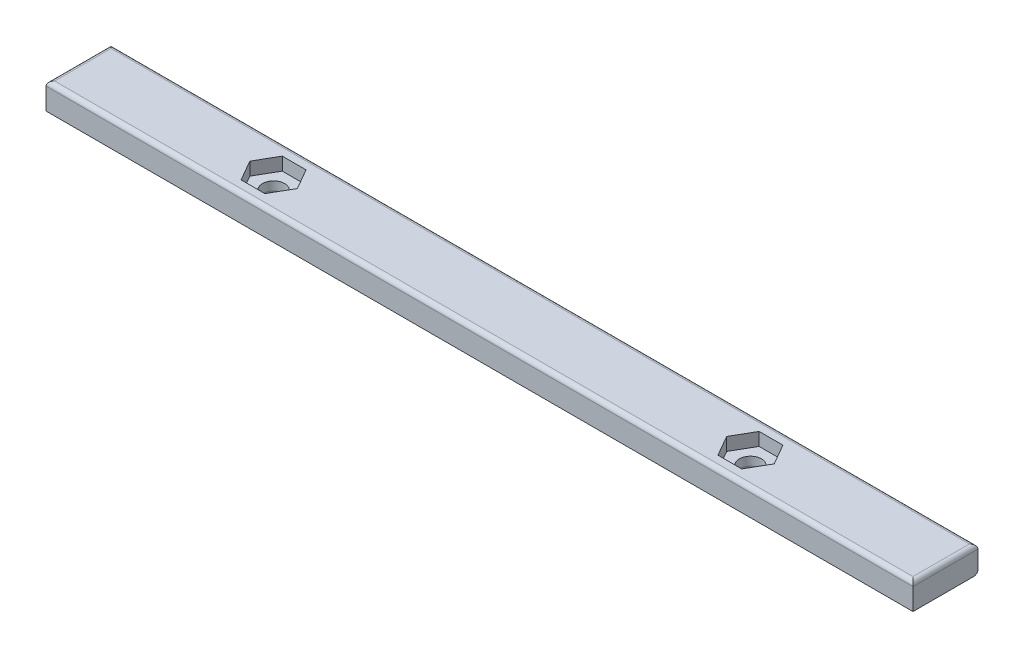
ISO-10303-21;
HEADER;
FILE_DESCRIPTION(('STEP AP214'),'2;1');
FILE_NAME('part.step','',(''),(''),'','','');
FILE_SCHEMA(('AUTOMOTIVE_DESIGN { 1 0 10303 214 1 1 1 1 }'));
ENDSEC;
DATA;
#1=APPLICATION_CONTEXT('core data for automotive mechanical design processes');
#2=APPLICATION_PROTOCOL_DEFINITION('international standard','automotive_design',2000,#1);
#3=PRODUCT_CONTEXT('',#1,'mechanical');
#4=PRODUCT('Part','Part','',(#3));
#5=PRODUCT_RELATED_PRODUCT_CATEGORY('part','',(#4));
#6=PRODUCT_DEFINITION_FORMATION('','',#4);
#7=PRODUCT_DEFINITION_CONTEXT('part definition',#1,'design');
#8=PRODUCT_DEFINITION('design','',#6,#7);
#9=PRODUCT_DEFINITION_SHAPE('','',#8);
#10=(LENGTH_UNIT() NAMED_UNIT(*) SI_UNIT(.MILLI.,.METRE.));
#11=(NAMED_UNIT(*) PLANE_ANGLE_UNIT() SI_UNIT($,.RADIAN.));
#12=(NAMED_UNIT(*) SI_UNIT($,.STERADIAN.) SOLID_ANGLE_UNIT());
#13=UNCERTAINTY_MEASURE_WITH_UNIT(LENGTH_MEASURE(1.E-05),#10,'distance_accuracy_value','');
#14=(GEOMETRIC_REPRESENTATION_CONTEXT(3) GLOBAL_UNCERTAINTY_ASSIGNED_CONTEXT((#13)) GLOBAL_UNIT_ASSIGNED_CONTEXT((#10,
#11,#12)) REPRESENTATION_CONTEXT('',''));
#15=CARTESIAN_POINT('',(0.,0.,0.));
#16=DIRECTION('',(0.,0.,1.));
#17=DIRECTION('',(1.,0.,0.));
#18=AXIS2_PLACEMENT_3D('',#15,#16,#17);
#19=CARTESIAN_POINT('',(-55.,6.,0.));
#20=DIRECTION('',(0.,-1.,0.));
#21=DIRECTION('',(0.,0.,-1.));
#22=AXIS2_PLACEMENT_3D('',#19,#20,#21);
#23=CYLINDRICAL_SURFACE('',#22,2.55);
#24=CARTESIAN_POINT('',(-55.,1.,0.));
#25=DIRECTION('',(0.,1.,0.));
#26=DIRECTION('',(0.,0.,1.));
#27=AXIS2_PLACEMENT_3D('',#24,#25,#26);
#28=CIRCLE('',#27,2.55);
#29=CARTESIAN_POINT('',(-55.,1.,2.55));
#30=VERTEX_POINT('',#29);
#31=EDGE_CURVE('E11',#30,#30,#28,.F.);
#32=ORIENTED_EDGE('',*,*,#31,.T.);
#33=EDGE_LOOP('',(#32));
#34=FACE_BOUND('',#33,.T.);
#35=CARTESIAN_POINT('',(-55.,3.,0.));
#36=DIRECTION('',(0.,1.,0.));
#37=DIRECTION('',(0.,0.,1.));
#38=AXIS2_PLACEMENT_3D('',#35,#36,#37);
#39=CIRCLE('',#38,2.55);
#40=CARTESIAN_POINT('',(-55.,3.,2.55));
#41=VERTEX_POINT('',#40);
#42=EDGE_CURVE('E36',#41,#41,#39,.T.);
#43=ORIENTED_EDGE('',*,*,#42,.T.);
#44=EDGE_LOOP('',(#43));
#45=FACE_BOUND('',#44,.T.);
#46=ADVANCED_FACE('F32',(#34,#45),#23,.F.);
#47=CARTESIAN_POINT('',(0.,6.,0.));
#48=DIRECTION('',(0.,1.,0.));
#49=DIRECTION('',(0.,0.,1.));
#50=AXIS2_PLACEMENT_3D('',#47,#48,#49);
#51=PLANE('',#50);
#52=DIRECTION('',(-0.5,0.,0.866025403784439));
#53=VECTOR('',#52,1.);
#54=CARTESIAN_POINT('',(-57.7424137786507,6.,-4.75000000000001));
#55=LINE('',#54,#53);
#56=CARTESIAN_POINT('',(-57.7424137786507,6.,-4.75000000000001));
#57=VERTEX_POINT('',#56);
#58=CARTESIAN_POINT('',(-60.4848275573014,6.,0.));
#59=VERTEX_POINT('',#58);
#60=EDGE_CURVE('E49',#57,#59,#55,.T.);
#61=ORIENTED_EDGE('',*,*,#60,.F.);
#62=DIRECTION('',(-1.,0.,0.));
#63=VECTOR('',#62,1.);
#64=CARTESIAN_POINT('',(-52.2575862213493,6.,-4.75000000000001));
#65=LINE('',#64,#63);
#66=CARTESIAN_POINT('',(-52.2575862213493,6.,-4.75000000000001));
#67=VERTEX_POINT('',#66);
#68=EDGE_CURVE('E186',#67,#57,#65,.T.);
#69=ORIENTED_EDGE('',*,*,#68,.F.);
#70=DIRECTION('',(-0.5,0.,-0.866025403784439));
#71=VECTOR('',#70,1.);
#72=CARTESIAN_POINT('',(-49.5151724426986,6.,0.));
#73=LINE('',#72,#71);
#74=CARTESIAN_POINT('',(-49.5151724426986,6.,0.));
#75=VERTEX_POINT('',#74);
#76=EDGE_CURVE('E189',#75,#67,#73,.T.);
#77=ORIENTED_EDGE('',*,*,#76,.F.);
#78=DIRECTION('',(0.5,0.,-0.866025403784439));
#79=VECTOR('',#78,1.);
#80=CARTESIAN_POINT('',(-52.2575862213493,6.,4.75));
#81=LINE('',#80,#79);
#82=CARTESIAN_POINT('',(-52.2575862213493,6.,4.75));
#83=VERTEX_POINT('',#82);
#84=EDGE_CURVE('E206',#83,#75,#81,.T.);
#85=ORIENTED_EDGE('',*,*,#84,.F.);
#86=DIRECTION('',(1.,0.,0.));
#87=VECTOR('',#86,1.);
#88=CARTESIAN_POINT('',(-57.7424137786507,6.,4.75));
#89=LINE('',#88,#87);
#90=CARTESIAN_POINT('',(-57.7424137786507,6.,4.75));
#91=VERTEX_POINT('',#90);
#92=EDGE_CURVE('E203',#91,#83,#89,.T.);
#93=ORIENTED_EDGE('',*,*,#92,.F.);
#94=DIRECTION('',(0.5,0.,0.866025403784439));
#95=VECTOR('',#94,1.);
#96=CARTESIAN_POINT('',(-60.4848275573014,6.,0.));
#97=LINE('',#96,#95);
#98=EDGE_CURVE('E200',#59,#91,#97,.T.);
#99=ORIENTED_EDGE('',*,*,#98,.F.);
#100=EDGE_LOOP('',(#61,#69,#77,#85,#93,#99));
#101=FACE_BOUND('',#100,.T.);
#102=DIRECTION('',(-1.,0.,0.));
#103=VECTOR('',#102,1.);
#104=CARTESIAN_POINT('',(52.2575862213493,6.,-4.75000000000001));
#105=LINE('',#104,#103);
#106=CARTESIAN_POINT('',(57.7424137786507,6.,-4.75000000000001));
#107=VERTEX_POINT('',#106);
#108=CARTESIAN_POINT('',(52.2575862213493,6.,-4.75000000000001));
#109=VERTEX_POINT('',#108);
#110=EDGE_CURVE('E57',#107,#109,#105,.T.);
#111=ORIENTED_EDGE('',*,*,#110,.F.);
#112=DIRECTION('',(-0.5,0.,-0.866025403784439));
#113=VECTOR('',#112,1.);
#114=CARTESIAN_POINT('',(57.7424137786507,6.,-4.75000000000001));
#115=LINE('',#114,#113);
#116=CARTESIAN_POINT('',(60.4848275573014,6.,0.));
#117=VERTEX_POINT('',#116);
#118=EDGE_CURVE('E225',#117,#107,#115,.T.);
#119=ORIENTED_EDGE('',*,*,#118,.F.);
#120=DIRECTION('',(0.5,0.,-0.866025403784439));
#121=VECTOR('',#120,1.);
#122=CARTESIAN_POINT('',(60.4848275573014,6.,0.));
#123=LINE('',#122,#121);
#124=CARTESIAN_POINT('',(57.7424137786507,6.,4.75));
#125=VERTEX_POINT('',#124);
#126=EDGE_CURVE('E251',#125,#117,#123,.T.);
#127=ORIENTED_EDGE('',*,*,#126,.F.);
#128=DIRECTION('',(1.,0.,0.));
#129=VECTOR('',#128,1.);
#130=CARTESIAN_POINT('',(57.7424137786507,6.,4.75));
#131=LINE('',#130,#129);
#132=CARTESIAN_POINT('',(52.2575862213493,6.,4.75));
#133=VERTEX_POINT('',#132);
#134=EDGE_CURVE('E248',#133,#125,#131,.T.);
#135=ORIENTED_EDGE('',*,*,#134,.F.);
#136=DIRECTION('',(0.5,0.,0.866025403784439));
#137=VECTOR('',#136,1.);
#138=CARTESIAN_POINT('',(52.2575862213493,6.,4.75));
#139=LINE('',#138,#137);
#140=CARTESIAN_POINT('',(49.5151724426986,6.,0.));
#141=VERTEX_POINT('',#140);
#142=EDGE_CURVE('E245',#141,#133,#139,.T.);
#143=ORIENTED_EDGE('',*,*,#142,.F.);
#144=DIRECTION('',(-0.5,0.,0.866025403784439));
#145=VECTOR('',#144,1.);
#146=CARTESIAN_POINT('',(49.5151724426986,6.,0.));
#147=LINE('',#146,#145);
#148=EDGE_CURVE('E242',#109,#141,#147,.T.);
#149=ORIENTED_EDGE('',*,*,#148,.F.);
#150=EDGE_LOOP('',(#111,#119,#127,#135,#143,#149));
#151=FACE_BOUND('',#150,.T.);
#152=DIRECTION('',(1.,0.,0.));
#153=VECTOR('',#152,1.);
#154=CARTESIAN_POINT('',(100.,6.,6.5));
#155=LINE('',#154,#153);
#156=CARTESIAN_POINT('',(-99.,6.,6.5));
#157=VERTEX_POINT('',#156);
#158=CARTESIAN_POINT('',(99.,6.,6.5));
#159=VERTEX_POINT('',#158);
#160=EDGE_CURVE('E290',#157,#159,#155,.T.);
#161=ORIENTED_EDGE('',*,*,#160,.T.);
#162=DIRECTION('',(0.,0.,-1.));
#163=VECTOR('',#162,1.);
#164=CARTESIAN_POINT('',(99.,6.,-7.49999999999999));
#165=LINE('',#164,#163);
#166=CARTESIAN_POINT('',(99.,6.,-6.50000000000001));
#167=VERTEX_POINT('',#166);
#168=EDGE_CURVE('E292',#159,#167,#165,.T.);
#169=ORIENTED_EDGE('',*,*,#168,.T.);
#170=DIRECTION('',(-1.,0.,0.));
#171=VECTOR('',#170,1.);
#172=CARTESIAN_POINT('',(-100.,6.,-6.49999999999998));
#173=LINE('',#172,#171);
#174=CARTESIAN_POINT('',(-99.,6.,-6.49999999999998));
#175=VERTEX_POINT('',#174);
#176=EDGE_CURVE('E286',#167,#175,#173,.T.);
#177=ORIENTED_EDGE('',*,*,#176,.T.);
#178=DIRECTION('',(0.,0.,1.));
#179=VECTOR('',#178,1.);
#180=CARTESIAN_POINT('',(-99.,6.,7.5));
#181=LINE('',#180,#179);
#182=EDGE_CURVE('E288',#175,#157,#181,.T.);
#183=ORIENTED_EDGE('',*,*,#182,.T.);
#184=EDGE_LOOP('',(#161,#169,#177,#183));
#185=FACE_BOUND('',#184,.T.);
#186=ADVANCED_FACE('F345',(#101,#151,#185),#51,.T.);
#187=CARTESIAN_POINT('',(0.,0.,0.));
#188=DIRECTION('',(0.,1.,0.));
#189=DIRECTION('',(0.,0.,1.));
#190=AXIS2_PLACEMENT_3D('',#187,#188,#189);
#191=PLANE('',#190);
#192=CARTESIAN_POINT('',(55.,0.,0.));
#193=DIRECTION('',(0.,1.,0.));
#194=DIRECTION('',(0.,0.,1.));
#195=AXIS2_PLACEMENT_3D('',#192,#193,#194);
#196=CIRCLE('',#195,3.54999999999999);
#197=CARTESIAN_POINT('',(55.,0.,3.54999999999997));
#198=VERTEX_POINT('',#197);
#199=EDGE_CURVE('E325',#198,#198,#196,.T.);
#200=ORIENTED_EDGE('',*,*,#199,.T.);
#201=EDGE_LOOP('',(#200));
#202=FACE_BOUND('',#201,.T.);
#203=CARTESIAN_POINT('',(-55.,0.,0.));
#204=DIRECTION('',(0.,1.,0.));
#205=DIRECTION('',(0.,0.,1.));
#206=AXIS2_PLACEMENT_3D('',#203,#204,#205);
#207=CIRCLE('',#206,3.55);
#208=CARTESIAN_POINT('',(-55.,0.,3.55));
#209=VERTEX_POINT('',#208);
#210=EDGE_CURVE('E313',#209,#209,#207,.T.);
#211=ORIENTED_EDGE('',*,*,#210,.T.);
#212=EDGE_LOOP('',(#211));
#213=FACE_BOUND('',#212,.T.);
#214=DIRECTION('',(0.,0.,1.));
#215=VECTOR('',#214,1.);
#216=CARTESIAN_POINT('',(-100.,0.,-7.49999999999999));
#217=LINE('',#216,#215);
#218=CARTESIAN_POINT('',(-100.,0.,-6.49999999999998));
#219=VERTEX_POINT('',#218);
#220=CARTESIAN_POINT('',(-100.,0.,7.5));
#221=VERTEX_POINT('',#220);
#222=EDGE_CURVE('E266',#219,#221,#217,.T.);
#223=ORIENTED_EDGE('',*,*,#222,.F.);
#224=DIRECTION('',(-1.,0.,0.));
#225=VECTOR('',#224,1.);
#226=CARTESIAN_POINT('',(0.,0.,-6.49999999999999));
#227=LINE('',#226,#225);
#228=CARTESIAN_POINT('',(100.,0.,-6.50000000000001));
#229=VERTEX_POINT('',#228);
#230=EDGE_CURVE('E311',#219,#229,#227,.F.);
#231=ORIENTED_EDGE('',*,*,#230,.T.);
#232=DIRECTION('',(0.,0.,-1.));
#233=VECTOR('',#232,1.);
#234=CARTESIAN_POINT('',(100.,0.,-7.49999999999999));
#235=LINE('',#234,#233);
#236=CARTESIAN_POINT('',(100.,0.,7.5));
#237=VERTEX_POINT('',#236);
#238=EDGE_CURVE('E272',#237,#229,#235,.T.);
#239=ORIENTED_EDGE('',*,*,#238,.F.);
#240=DIRECTION('',(1.,0.,0.));
#241=VECTOR('',#240,1.);
#242=CARTESIAN_POINT('',(100.,0.,7.5));
#243=LINE('',#242,#241);
#244=EDGE_CURVE('E268',#221,#237,#243,.T.);
#245=ORIENTED_EDGE('',*,*,#244,.F.);
#246=EDGE_LOOP('',(#223,#231,#239,#245));
#247=FACE_BOUND('',#246,.T.);
#248=ADVANCED_FACE('F351',(#202,#213,#247),#191,.F.);
#249=CARTESIAN_POINT('',(-100.,6.,-7.49999999999999));
#250=DIRECTION('',(1.,0.,0.));
#251=DIRECTION('',(0.,0.,-1.));
#252=AXIS2_PLACEMENT_3D('',#249,#250,#251);
#253=PLANE('',#252);
#254=DIRECTION('',(0.,-1.,0.));
#255=VECTOR('',#254,1.);
#256=CARTESIAN_POINT('',(-100.,6.,7.5));
#257=LINE('',#256,#255);
#258=CARTESIAN_POINT('',(-100.,5.,7.5));
#259=VERTEX_POINT('',#258);
#260=EDGE_CURVE('E280',#259,#221,#257,.T.);
#261=ORIENTED_EDGE('',*,*,#260,.F.);
#262=DIRECTION('',(0.,0.,1.));
#263=VECTOR('',#262,1.);
#264=CARTESIAN_POINT('',(-100.,5.,-7.49999999999999));
#265=LINE('',#264,#263);
#266=CARTESIAN_POINT('',(-100.,5.,-7.49999999999999));
#267=VERTEX_POINT('',#266);
#268=EDGE_CURVE('E304',#259,#267,#265,.F.);
#269=ORIENTED_EDGE('',*,*,#268,.T.);
#270=DIRECTION('',(0.,-1.,0.));
#271=VECTOR('',#270,1.);
#272=CARTESIAN_POINT('',(-100.,6.,-7.49999999999999));
#273=LINE('',#272,#271);
#274=CARTESIAN_POINT('',(-100.,1.,-7.49999999999999));
#275=VERTEX_POINT('',#274);
#276=EDGE_CURVE('E283',#267,#275,#273,.T.);
#277=ORIENTED_EDGE('',*,*,#276,.T.);
#278=CARTESIAN_POINT('',(-100.,1.,-6.49999999999998));
#279=DIRECTION('',(1.,0.,0.));
#280=DIRECTION('',(0.,0.,-1.));
#281=AXIS2_PLACEMENT_3D('',#278,#279,#280);
#282=CIRCLE('',#281,1.);
#283=EDGE_CURVE('E302',#275,#219,#282,.F.);
#284=ORIENTED_EDGE('',*,*,#283,.T.);
#285=ORIENTED_EDGE('',*,*,#222,.T.);
#286=EDGE_LOOP('',(#261,#269,#277,#284,#285));
#287=FACE_BOUND('',#286,.T.);
#288=ADVANCED_FACE('F360',(#287),#253,.F.);
#289=CARTESIAN_POINT('',(100.,6.,7.5));
#290=DIRECTION('',(0.,0.,-1.));
#291=DIRECTION('',(-1.,0.,0.));
#292=AXIS2_PLACEMENT_3D('',#289,#290,#291);
#293=PLANE('',#292);
#294=DIRECTION('',(0.,-1.,0.));
#295=VECTOR('',#294,1.);
#296=CARTESIAN_POINT('',(100.,6.,7.5));
#297=LINE('',#296,#295);
#298=CARTESIAN_POINT('',(100.,5.,7.5));
#299=VERTEX_POINT('',#298);
#300=EDGE_CURVE('E278',#299,#237,#297,.T.);
#301=ORIENTED_EDGE('',*,*,#300,.F.);
#302=DIRECTION('',(1.,0.,0.));
#303=VECTOR('',#302,1.);
#304=CARTESIAN_POINT('',(-100.,5.,7.5));
#305=LINE('',#304,#303);
#306=EDGE_CURVE('E300',#299,#259,#305,.F.);
#307=ORIENTED_EDGE('',*,*,#306,.T.);
#308=ORIENTED_EDGE('',*,*,#260,.T.);
#309=ORIENTED_EDGE('',*,*,#244,.T.);
#310=EDGE_LOOP('',(#301,#307,#308,#309));
#311=FACE_BOUND('',#310,.T.);
#312=ADVANCED_FACE('F369',(#311),#293,.F.);
#313=CARTESIAN_POINT('',(100.,6.,-7.49999999999999));
#314=DIRECTION('',(-1.,0.,0.));
#315=DIRECTION('',(0.,0.,1.));
#316=AXIS2_PLACEMENT_3D('',#313,#314,#315);
#317=PLANE('',#316);
#318=DIRECTION('',(0.,-1.,0.));
#319=VECTOR('',#318,1.);
#320=CARTESIAN_POINT('',(100.,6.,-7.49999999999999));
#321=LINE('',#320,#319);
#322=CARTESIAN_POINT('',(100.,5.,-7.49999999999999));
#323=VERTEX_POINT('',#322);
#324=CARTESIAN_POINT('',(100.,1.,-7.49999999999999));
#325=VERTEX_POINT('',#324);
#326=EDGE_CURVE('E275',#323,#325,#321,.T.);
#327=ORIENTED_EDGE('',*,*,#326,.F.);
#328=DIRECTION('',(0.,0.,-1.));
#329=VECTOR('',#328,1.);
#330=CARTESIAN_POINT('',(100.,5.,7.5));
#331=LINE('',#330,#329);
#332=EDGE_CURVE('E297',#323,#299,#331,.F.);
#333=ORIENTED_EDGE('',*,*,#332,.T.);
#334=ORIENTED_EDGE('',*,*,#300,.T.);
#335=ORIENTED_EDGE('',*,*,#238,.T.);
#336=CARTESIAN_POINT('',(100.,1.,-6.50000000000001));
#337=DIRECTION('',(-1.,0.,0.));
#338=DIRECTION('',(0.,0.,1.));
#339=AXIS2_PLACEMENT_3D('',#336,#337,#338);
#340=CIRCLE('',#339,1.);
#341=EDGE_CURVE('E295',#229,#325,#340,.F.);
#342=ORIENTED_EDGE('',*,*,#341,.T.);
#343=EDGE_LOOP('',(#327,#333,#334,#335,#342));
#344=FACE_BOUND('',#343,.T.);
#345=ADVANCED_FACE('F365',(#344),#317,.F.);
#346=CARTESIAN_POINT('',(-55.,6.,-7.49999999999999));
#347=DIRECTION('',(0.,0.,1.));
#348=DIRECTION('',(1.,0.,0.));
#349=AXIS2_PLACEMENT_3D('',#346,#347,#348);
#350=PLANE('',#349);
#351=ORIENTED_EDGE('',*,*,#276,.F.);
#352=DIRECTION('',(-1.,0.,0.));
#353=VECTOR('',#352,1.);
#354=CARTESIAN_POINT('',(100.,5.,-7.50000000000001));
#355=LINE('',#354,#353);
#356=EDGE_CURVE('E309',#267,#323,#355,.F.);
#357=ORIENTED_EDGE('',*,*,#356,.T.);
#358=ORIENTED_EDGE('',*,*,#326,.T.);
#359=DIRECTION('',(-1.,0.,0.));
#360=VECTOR('',#359,1.);
#361=CARTESIAN_POINT('',(-55.,1.,-7.49999999999999));
#362=LINE('',#361,#360);
#363=EDGE_CURVE('E306',#325,#275,#362,.T.);
#364=ORIENTED_EDGE('',*,*,#363,.T.);
#365=EDGE_LOOP('',(#351,#357,#358,#364));
#366=FACE_BOUND('',#365,.T.);
#367=ADVANCED_FACE('F362',(#366),#350,.F.);
#368=CARTESIAN_POINT('',(55.,6.,0.));
#369=DIRECTION('',(0.,-1.,0.));
#370=DIRECTION('',(0.,0.,-1.));
#371=AXIS2_PLACEMENT_3D('',#368,#369,#370);
#372=CYLINDRICAL_SURFACE('',#371,2.54999999999999);
#373=CARTESIAN_POINT('',(55.,3.,0.));
#374=DIRECTION('',(0.,-1.,0.));
#375=DIRECTION('',(0.,0.,-1.));
#376=AXIS2_PLACEMENT_3D('',#373,#374,#375);
#377=CIRCLE('',#376,2.54999999999999);
#378=CARTESIAN_POINT('',(55.,3.,-2.55000000000001));
#379=VERTEX_POINT('',#378);
#380=EDGE_CURVE('E213',#379,#379,#377,.T.);
#381=ORIENTED_EDGE('',*,*,#380,.F.);
#382=EDGE_LOOP('',(#381));
#383=FACE_BOUND('',#382,.T.);
#384=CARTESIAN_POINT('',(55.,1.,0.));
#385=DIRECTION('',(0.,1.,0.));
#386=DIRECTION('',(0.,0.,1.));
#387=AXIS2_PLACEMENT_3D('',#384,#385,#386);
#388=CIRCLE('',#387,2.54999999999999);
#389=CARTESIAN_POINT('',(55.,1.,2.54999999999997));
#390=VERTEX_POINT('',#389);
#391=EDGE_CURVE('E41',#390,#390,#388,.F.);
#392=ORIENTED_EDGE('',*,*,#391,.T.);
#393=EDGE_LOOP('',(#392));
#394=FACE_BOUND('',#393,.T.);
#395=ADVANCED_FACE('F355',(#383,#394),#372,.F.);
#396=CARTESIAN_POINT('',(-99.,5.,0.));
#397=DIRECTION('',(0.,0.,-1.));
#398=DIRECTION('',(-1.,0.,0.));
#399=AXIS2_PLACEMENT_3D('',#396,#397,#398);
#400=CYLINDRICAL_SURFACE('',#399,1.);
#401=CARTESIAN_POINT('',(-99.,5.,-6.49999999999998));
#402=DIRECTION('',(0.707106781186547,0.,-0.707106781186548));
#403=DIRECTION('',(0.707106781186548,0.,0.707106781186547));
#404=AXIS2_PLACEMENT_3D('',#401,#402,#403);
#405=ELLIPSE('',#404,1.41421356237309,1.);
#406=EDGE_CURVE('E318',#267,#175,#405,.T.);
#407=ORIENTED_EDGE('',*,*,#406,.F.);
#408=ORIENTED_EDGE('',*,*,#268,.F.);
#409=CARTESIAN_POINT('',(-99.,5.,6.5));
#410=DIRECTION('',(-0.707106781186547,0.,-0.707106781186547));
#411=DIRECTION('',(0.707106781186547,0.,-0.707106781186547));
#412=AXIS2_PLACEMENT_3D('',#409,#410,#411);
#413=ELLIPSE('',#412,1.41421356237309,1.);
#414=EDGE_CURVE('E269',#157,#259,#413,.F.);
#415=ORIENTED_EDGE('',*,*,#414,.F.);
#416=ORIENTED_EDGE('',*,*,#182,.F.);
#417=EDGE_LOOP('',(#407,#408,#415,#416));
#418=FACE_BOUND('',#417,.T.);
#419=ADVANCED_FACE('F389',(#418),#400,.T.);
#420=CARTESIAN_POINT('',(0.,5.,6.5));
#421=DIRECTION('',(-1.,0.,0.));
#422=DIRECTION('',(0.,0.,1.));
#423=AXIS2_PLACEMENT_3D('',#420,#421,#422);
#424=CYLINDRICAL_SURFACE('',#423,1.);
#425=ORIENTED_EDGE('',*,*,#414,.T.);
#426=ORIENTED_EDGE('',*,*,#306,.F.);
#427=CARTESIAN_POINT('',(99.,5.,6.5));
#428=DIRECTION('',(-0.707106781186547,0.,0.707106781186547));
#429=DIRECTION('',(-0.707106781186547,0.,-0.707106781186547));
#430=AXIS2_PLACEMENT_3D('',#427,#428,#429);
#431=ELLIPSE('',#430,1.41421356237309,1.);
#432=EDGE_CURVE('E316',#159,#299,#431,.F.);
#433=ORIENTED_EDGE('',*,*,#432,.F.);
#434=ORIENTED_EDGE('',*,*,#160,.F.);
#435=EDGE_LOOP('',(#425,#426,#433,#434));
#436=FACE_BOUND('',#435,.T.);
#437=ADVANCED_FACE('F385',(#436),#424,.T.);
#438=CARTESIAN_POINT('',(0.,5.,-6.49999999999999));
#439=DIRECTION('',(1.,0.,0.));
#440=DIRECTION('',(0.,0.,-1.));
#441=AXIS2_PLACEMENT_3D('',#438,#439,#440);
#442=CYLINDRICAL_SURFACE('',#441,1.);
#443=ORIENTED_EDGE('',*,*,#406,.T.);
#444=ORIENTED_EDGE('',*,*,#176,.F.);
#445=CARTESIAN_POINT('',(99.,5.,-6.50000000000001));
#446=DIRECTION('',(0.707106781186548,0.,0.707106781186547));
#447=DIRECTION('',(0.707106781186547,0.,-0.707106781186548));
#448=AXIS2_PLACEMENT_3D('',#445,#446,#447);
#449=ELLIPSE('',#448,1.4142135623731,1.);
#450=EDGE_CURVE('E314',#323,#167,#449,.T.);
#451=ORIENTED_EDGE('',*,*,#450,.F.);
#452=ORIENTED_EDGE('',*,*,#356,.F.);
#453=EDGE_LOOP('',(#443,#444,#451,#452));
#454=FACE_BOUND('',#453,.T.);
#455=ADVANCED_FACE('F381',(#454),#442,.T.);
#456=CARTESIAN_POINT('',(99.,5.,0.));
#457=DIRECTION('',(0.,0.,1.));
#458=DIRECTION('',(1.,0.,0.));
#459=AXIS2_PLACEMENT_3D('',#456,#457,#458);
#460=CYLINDRICAL_SURFACE('',#459,1.);
#461=ORIENTED_EDGE('',*,*,#432,.T.);
#462=ORIENTED_EDGE('',*,*,#332,.F.);
#463=ORIENTED_EDGE('',*,*,#450,.T.);
#464=ORIENTED_EDGE('',*,*,#168,.F.);
#465=EDGE_LOOP('',(#461,#462,#463,#464));
#466=FACE_BOUND('',#465,.T.);
#467=ADVANCED_FACE('F377',(#466),#460,.T.);
#468=CARTESIAN_POINT('',(-55.,1.,-6.49999999999999));
#469=DIRECTION('',(-1.,0.,0.));
#470=DIRECTION('',(0.,0.,1.));
#471=AXIS2_PLACEMENT_3D('',#468,#469,#470);
#472=CYLINDRICAL_SURFACE('',#471,1.);
#473=ORIENTED_EDGE('',*,*,#341,.F.);
#474=ORIENTED_EDGE('',*,*,#230,.F.);
#475=ORIENTED_EDGE('',*,*,#283,.F.);
#476=ORIENTED_EDGE('',*,*,#363,.F.);
#477=EDGE_LOOP('',(#473,#474,#475,#476));
#478=FACE_BOUND('',#477,.T.);
#479=ADVANCED_FACE('F380',(#478),#472,.T.);
#480=CARTESIAN_POINT('',(55.,1.,0.));
#481=DIRECTION('',(0.,1.,0.));
#482=DIRECTION('',(0.,0.,1.));
#483=AXIS2_PLACEMENT_3D('',#480,#481,#482);
#484=TOROIDAL_SURFACE('',#483,3.54999999999999,1.);
#485=ORIENTED_EDGE('',*,*,#391,.F.);
#486=EDGE_LOOP('',(#485));
#487=FACE_BOUND('',#486,.T.);
#488=ORIENTED_EDGE('',*,*,#199,.F.);
#489=EDGE_LOOP('',(#488));
#490=FACE_BOUND('',#489,.T.);
#491=ADVANCED_FACE('F395',(#487,#490),#484,.T.);
#492=CARTESIAN_POINT('',(-55.,1.,0.));
#493=DIRECTION('',(0.,1.,0.));
#494=DIRECTION('',(0.,0.,1.));
#495=AXIS2_PLACEMENT_3D('',#492,#493,#494);
#496=TOROIDAL_SURFACE('',#495,3.55,1.);
#497=ORIENTED_EDGE('',*,*,#31,.F.);
#498=EDGE_LOOP('',(#497));
#499=FACE_BOUND('',#498,.T.);
#500=ORIENTED_EDGE('',*,*,#210,.F.);
#501=EDGE_LOOP('',(#500));
#502=FACE_BOUND('',#501,.T.);
#503=ADVANCED_FACE('F34',(#499,#502),#496,.T.);
#504=CARTESIAN_POINT('',(52.2575862213493,3.,-4.75000000000001));
#505=DIRECTION('',(0.,0.,-1.));
#506=DIRECTION('',(-1.,0.,0.));
#507=AXIS2_PLACEMENT_3D('',#504,#505,#506);
#508=PLANE('',#507);
#509=ORIENTED_EDGE('',*,*,#110,.T.);
#510=DIRECTION('',(0.,1.,0.));
#511=VECTOR('',#510,1.);
#512=CARTESIAN_POINT('',(52.2575862213493,3.,-4.75000000000001));
#513=LINE('',#512,#511);
#514=CARTESIAN_POINT('',(52.2575862213493,3.,-4.75000000000001));
#515=VERTEX_POINT('',#514);
#516=EDGE_CURVE('E240',#515,#109,#513,.T.);
#517=ORIENTED_EDGE('',*,*,#516,.F.);
#518=DIRECTION('',(-1.,0.,0.));
#519=VECTOR('',#518,1.);
#520=CARTESIAN_POINT('',(52.2575862213493,3.,-4.75000000000001));
#521=LINE('',#520,#519);
#522=CARTESIAN_POINT('',(57.7424137786507,3.,-4.75000000000001));
#523=VERTEX_POINT('',#522);
#524=EDGE_CURVE('E221',#523,#515,#521,.T.);
#525=ORIENTED_EDGE('',*,*,#524,.F.);
#526=DIRECTION('',(0.,1.,0.));
#527=VECTOR('',#526,1.);
#528=CARTESIAN_POINT('',(57.7424137786507,3.,-4.75000000000001));
#529=LINE('',#528,#527);
#530=EDGE_CURVE('E201',#523,#107,#529,.T.);
#531=ORIENTED_EDGE('',*,*,#530,.T.);
#532=EDGE_LOOP('',(#509,#517,#525,#531));
#533=FACE_BOUND('',#532,.T.);
#534=ADVANCED_FACE('F402',(#533),#508,.F.);
#535=CARTESIAN_POINT('',(57.7424137786507,3.,-4.75000000000001));
#536=DIRECTION('',(0.866025403784439,0.,-0.5));
#537=DIRECTION('',(-0.5,0.,-0.866025403784439));
#538=AXIS2_PLACEMENT_3D('',#535,#536,#537);
#539=PLANE('',#538);
#540=ORIENTED_EDGE('',*,*,#118,.T.);
#541=ORIENTED_EDGE('',*,*,#530,.F.);
#542=DIRECTION('',(-0.5,0.,-0.866025403784439));
#543=VECTOR('',#542,1.);
#544=CARTESIAN_POINT('',(57.7424137786507,3.,-4.75000000000001));
#545=LINE('',#544,#543);
#546=CARTESIAN_POINT('',(60.4848275573014,3.,0.));
#547=VERTEX_POINT('',#546);
#548=EDGE_CURVE('E237',#547,#523,#545,.T.);
#549=ORIENTED_EDGE('',*,*,#548,.F.);
#550=DIRECTION('',(0.,1.,0.));
#551=VECTOR('',#550,1.);
#552=CARTESIAN_POINT('',(60.4848275573014,3.,0.));
#553=LINE('',#552,#551);
#554=EDGE_CURVE('E257',#547,#117,#553,.T.);
#555=ORIENTED_EDGE('',*,*,#554,.T.);
#556=EDGE_LOOP('',(#540,#541,#549,#555));
#557=FACE_BOUND('',#556,.T.);
#558=ADVANCED_FACE('F498',(#557),#539,.F.);
#559=CARTESIAN_POINT('',(60.4848275573014,3.,0.));
#560=DIRECTION('',(0.866025403784439,0.,0.5));
#561=DIRECTION('',(0.5,0.,-0.866025403784439));
#562=AXIS2_PLACEMENT_3D('',#559,#560,#561);
#563=PLANE('',#562);
#564=ORIENTED_EDGE('',*,*,#126,.T.);
#565=ORIENTED_EDGE('',*,*,#554,.F.);
#566=DIRECTION('',(0.5,0.,-0.866025403784439));
#567=VECTOR('',#566,1.);
#568=CARTESIAN_POINT('',(60.4848275573014,3.,0.));
#569=LINE('',#568,#567);
#570=CARTESIAN_POINT('',(57.7424137786507,3.,4.75));
#571=VERTEX_POINT('',#570);
#572=EDGE_CURVE('E234',#571,#547,#569,.T.);
#573=ORIENTED_EDGE('',*,*,#572,.F.);
#574=DIRECTION('',(0.,1.,0.));
#575=VECTOR('',#574,1.);
#576=CARTESIAN_POINT('',(57.7424137786507,3.,4.75));
#577=LINE('',#576,#575);
#578=EDGE_CURVE('E259',#571,#125,#577,.T.);
#579=ORIENTED_EDGE('',*,*,#578,.T.);
#580=EDGE_LOOP('',(#564,#565,#573,#579));
#581=FACE_BOUND('',#580,.T.);
#582=ADVANCED_FACE('F505',(#581),#563,.F.);
#583=CARTESIAN_POINT('',(57.7424137786507,3.,4.75));
#584=DIRECTION('',(0.,0.,1.));
#585=DIRECTION('',(1.,0.,0.));
#586=AXIS2_PLACEMENT_3D('',#583,#584,#585);
#587=PLANE('',#586);
#588=ORIENTED_EDGE('',*,*,#134,.T.);
#589=ORIENTED_EDGE('',*,*,#578,.F.);
#590=DIRECTION('',(1.,0.,0.));
#591=VECTOR('',#590,1.);
#592=CARTESIAN_POINT('',(57.7424137786507,3.,4.75));
#593=LINE('',#592,#591);
#594=CARTESIAN_POINT('',(52.2575862213493,3.,4.75));
#595=VERTEX_POINT('',#594);
#596=EDGE_CURVE('E231',#595,#571,#593,.T.);
#597=ORIENTED_EDGE('',*,*,#596,.F.);
#598=DIRECTION('',(0.,1.,0.));
#599=VECTOR('',#598,1.);
#600=CARTESIAN_POINT('',(52.2575862213493,3.,4.75));
#601=LINE('',#600,#599);
#602=EDGE_CURVE('E261',#595,#133,#601,.T.);
#603=ORIENTED_EDGE('',*,*,#602,.T.);
#604=EDGE_LOOP('',(#588,#589,#597,#603));
#605=FACE_BOUND('',#604,.T.);
#606=ADVANCED_FACE('F514',(#605),#587,.F.);
#607=CARTESIAN_POINT('',(52.2575862213493,3.,4.75));
#608=DIRECTION('',(-0.866025403784439,0.,0.5));
#609=DIRECTION('',(0.5,0.,0.866025403784439));
#610=AXIS2_PLACEMENT_3D('',#607,#608,#609);
#611=PLANE('',#610);
#612=ORIENTED_EDGE('',*,*,#142,.T.);
#613=ORIENTED_EDGE('',*,*,#602,.F.);
#614=DIRECTION('',(0.5,0.,0.866025403784439));
#615=VECTOR('',#614,1.);
#616=CARTESIAN_POINT('',(52.2575862213493,3.,4.75));
#617=LINE('',#616,#615);
#618=CARTESIAN_POINT('',(49.5151724426986,3.,0.));
#619=VERTEX_POINT('',#618);
#620=EDGE_CURVE('E228',#619,#595,#617,.T.);
#621=ORIENTED_EDGE('',*,*,#620,.F.);
#622=DIRECTION('',(0.,1.,0.));
#623=VECTOR('',#622,1.);
#624=CARTESIAN_POINT('',(49.5151724426986,3.,0.));
#625=LINE('',#624,#623);
#626=EDGE_CURVE('E263',#619,#141,#625,.T.);
#627=ORIENTED_EDGE('',*,*,#626,.T.);
#628=EDGE_LOOP('',(#612,#613,#621,#627));
#629=FACE_BOUND('',#628,.T.);
#630=ADVANCED_FACE('F523',(#629),#611,.F.);
#631=CARTESIAN_POINT('',(49.5151724426986,3.,0.));
#632=DIRECTION('',(-0.866025403784439,0.,-0.5));
#633=DIRECTION('',(-0.5,0.,0.866025403784439));
#634=AXIS2_PLACEMENT_3D('',#631,#632,#633);
#635=PLANE('',#634);
#636=ORIENTED_EDGE('',*,*,#148,.T.);
#637=ORIENTED_EDGE('',*,*,#626,.F.);
#638=DIRECTION('',(-0.5,0.,0.866025403784439));
#639=VECTOR('',#638,1.);
#640=CARTESIAN_POINT('',(49.5151724426986,3.,0.));
#641=LINE('',#640,#639);
#642=EDGE_CURVE('E224',#515,#619,#641,.T.);
#643=ORIENTED_EDGE('',*,*,#642,.F.);
#644=ORIENTED_EDGE('',*,*,#516,.T.);
#645=EDGE_LOOP('',(#636,#637,#643,#644));
#646=FACE_BOUND('',#645,.T.);
#647=ADVANCED_FACE('F532',(#646),#635,.F.);
#648=CARTESIAN_POINT('',(0.,3.,0.));
#649=DIRECTION('',(0.,-1.,0.));
#650=DIRECTION('',(0.,0.,-1.));
#651=AXIS2_PLACEMENT_3D('',#648,#649,#650);
#652=PLANE('',#651);
#653=ORIENTED_EDGE('',*,*,#380,.T.);
#654=EDGE_LOOP('',(#653));
#655=FACE_BOUND('',#654,.T.);
#656=ORIENTED_EDGE('',*,*,#524,.T.);
#657=ORIENTED_EDGE('',*,*,#642,.T.);
#658=ORIENTED_EDGE('',*,*,#620,.T.);
#659=ORIENTED_EDGE('',*,*,#596,.T.);
#660=ORIENTED_EDGE('',*,*,#572,.T.);
#661=ORIENTED_EDGE('',*,*,#548,.T.);
#662=EDGE_LOOP('',(#656,#657,#658,#659,#660,#661));
#663=FACE_BOUND('',#662,.T.);
#664=ADVANCED_FACE('F541',(#655,#663),#652,.F.);
#665=CARTESIAN_POINT('',(-57.7424137786507,3.,-4.75000000000001));
#666=DIRECTION('',(-0.866025403784439,0.,-0.5));
#667=DIRECTION('',(-0.5,0.,0.866025403784439));
#668=AXIS2_PLACEMENT_3D('',#665,#666,#667);
#669=PLANE('',#668);
#670=ORIENTED_EDGE('',*,*,#60,.T.);
#671=DIRECTION('',(0.,1.,0.));
#672=VECTOR('',#671,1.);
#673=CARTESIAN_POINT('',(-60.4848275573014,3.,0.));
#674=LINE('',#673,#672);
#675=CARTESIAN_POINT('',(-60.4848275573014,3.,0.));
#676=VERTEX_POINT('',#675);
#677=EDGE_CURVE('E163',#676,#59,#674,.T.);
#678=ORIENTED_EDGE('',*,*,#677,.F.);
#679=DIRECTION('',(-0.5,0.,0.866025403784439));
#680=VECTOR('',#679,1.);
#681=CARTESIAN_POINT('',(-57.7424137786507,3.,-4.75000000000001));
#682=LINE('',#681,#680);
#683=CARTESIAN_POINT('',(-57.7424137786507,3.,-4.75000000000001));
#684=VERTEX_POINT('',#683);
#685=EDGE_CURVE('E167',#684,#676,#682,.T.);
#686=ORIENTED_EDGE('',*,*,#685,.F.);
#687=DIRECTION('',(0.,1.,0.));
#688=VECTOR('',#687,1.);
#689=CARTESIAN_POINT('',(-57.7424137786507,3.,-4.75000000000001));
#690=LINE('',#689,#688);
#691=EDGE_CURVE('E211',#684,#57,#690,.T.);
#692=ORIENTED_EDGE('',*,*,#691,.T.);
#693=EDGE_LOOP('',(#670,#678,#686,#692));
#694=FACE_BOUND('',#693,.T.);
#695=ADVANCED_FACE('F165',(#694),#669,.F.);
#696=CARTESIAN_POINT('',(-52.2575862213493,3.,-4.75000000000001));
#697=DIRECTION('',(0.,0.,-1.));
#698=DIRECTION('',(-1.,0.,0.));
#699=AXIS2_PLACEMENT_3D('',#696,#697,#698);
#700=PLANE('',#699);
#701=ORIENTED_EDGE('',*,*,#68,.T.);
#702=ORIENTED_EDGE('',*,*,#691,.F.);
#703=DIRECTION('',(-1.,0.,0.));
#704=VECTOR('',#703,1.);
#705=CARTESIAN_POINT('',(-52.2575862213493,3.,-4.75000000000001));
#706=LINE('',#705,#704);
#707=CARTESIAN_POINT('',(-52.2575862213493,3.,-4.75000000000001));
#708=VERTEX_POINT('',#707);
#709=EDGE_CURVE('E173',#708,#684,#706,.T.);
#710=ORIENTED_EDGE('',*,*,#709,.F.);
#711=DIRECTION('',(0.,1.,0.));
#712=VECTOR('',#711,1.);
#713=CARTESIAN_POINT('',(-52.2575862213493,3.,-4.75000000000001));
#714=LINE('',#713,#712);
#715=EDGE_CURVE('E214',#708,#67,#714,.T.);
#716=ORIENTED_EDGE('',*,*,#715,.T.);
#717=EDGE_LOOP('',(#701,#702,#710,#716));
#718=FACE_BOUND('',#717,.T.);
#719=ADVANCED_FACE('F557',(#718),#700,.F.);
#720=CARTESIAN_POINT('',(-49.5151724426986,3.,0.));
#721=DIRECTION('',(0.866025403784439,0.,-0.5));
#722=DIRECTION('',(-0.5,0.,-0.866025403784439));
#723=AXIS2_PLACEMENT_3D('',#720,#721,#722);
#724=PLANE('',#723);
#725=ORIENTED_EDGE('',*,*,#76,.T.);
#726=ORIENTED_EDGE('',*,*,#715,.F.);
#727=DIRECTION('',(-0.5,0.,-0.866025403784439));
#728=VECTOR('',#727,1.);
#729=CARTESIAN_POINT('',(-49.5151724426986,3.,0.));
#730=LINE('',#729,#728);
#731=CARTESIAN_POINT('',(-49.5151724426986,3.,0.));
#732=VERTEX_POINT('',#731);
#733=EDGE_CURVE('E196',#732,#708,#730,.T.);
#734=ORIENTED_EDGE('',*,*,#733,.F.);
#735=DIRECTION('',(0.,1.,0.));
#736=VECTOR('',#735,1.);
#737=CARTESIAN_POINT('',(-49.5151724426986,3.,0.));
#738=LINE('',#737,#736);
#739=EDGE_CURVE('E216',#732,#75,#738,.T.);
#740=ORIENTED_EDGE('',*,*,#739,.T.);
#741=EDGE_LOOP('',(#725,#726,#734,#740));
#742=FACE_BOUND('',#741,.T.);
#743=ADVANCED_FACE('F565',(#742),#724,.F.);
#744=CARTESIAN_POINT('',(-52.2575862213493,3.,4.75));
#745=DIRECTION('',(0.866025403784439,0.,0.5));
#746=DIRECTION('',(0.5,0.,-0.866025403784439));
#747=AXIS2_PLACEMENT_3D('',#744,#745,#746);
#748=PLANE('',#747);
#749=ORIENTED_EDGE('',*,*,#84,.T.);
#750=ORIENTED_EDGE('',*,*,#739,.F.);
#751=DIRECTION('',(0.5,0.,-0.866025403784439));
#752=VECTOR('',#751,1.);
#753=CARTESIAN_POINT('',(-52.2575862213493,3.,4.75));
#754=LINE('',#753,#752);
#755=CARTESIAN_POINT('',(-52.2575862213493,3.,4.75));
#756=VERTEX_POINT('',#755);
#757=EDGE_CURVE('E193',#756,#732,#754,.T.);
#758=ORIENTED_EDGE('',*,*,#757,.F.);
#759=DIRECTION('',(0.,1.,0.));
#760=VECTOR('',#759,1.);
#761=CARTESIAN_POINT('',(-52.2575862213493,3.,4.75));
#762=LINE('',#761,#760);
#763=EDGE_CURVE('E218',#756,#83,#762,.T.);
#764=ORIENTED_EDGE('',*,*,#763,.T.);
#765=EDGE_LOOP('',(#749,#750,#758,#764));
#766=FACE_BOUND('',#765,.T.);
#767=ADVANCED_FACE('F573',(#766),#748,.F.);
#768=CARTESIAN_POINT('',(-57.7424137786507,3.,4.75));
#769=DIRECTION('',(0.,0.,1.));
#770=DIRECTION('',(1.,0.,0.));
#771=AXIS2_PLACEMENT_3D('',#768,#769,#770);
#772=PLANE('',#771);
#773=ORIENTED_EDGE('',*,*,#92,.T.);
#774=ORIENTED_EDGE('',*,*,#763,.F.);
#775=DIRECTION('',(1.,0.,0.));
#776=VECTOR('',#775,1.);
#777=CARTESIAN_POINT('',(-57.7424137786507,3.,4.75));
#778=LINE('',#777,#776);
#779=CARTESIAN_POINT('',(-57.7424137786507,3.,4.75));
#780=VERTEX_POINT('',#779);
#781=EDGE_CURVE('E181',#780,#756,#778,.T.);
#782=ORIENTED_EDGE('',*,*,#781,.F.);
#783=DIRECTION('',(0.,1.,0.));
#784=VECTOR('',#783,1.);
#785=CARTESIAN_POINT('',(-57.7424137786507,3.,4.75));
#786=LINE('',#785,#784);
#787=EDGE_CURVE('E172',#780,#91,#786,.T.);
#788=ORIENTED_EDGE('',*,*,#787,.T.);
#789=EDGE_LOOP('',(#773,#774,#782,#788));
#790=FACE_BOUND('',#789,.T.);
#791=ADVANCED_FACE('F341',(#790),#772,.F.);
#792=CARTESIAN_POINT('',(-60.4848275573014,3.,0.));
#793=DIRECTION('',(-0.866025403784439,0.,0.5));
#794=DIRECTION('',(0.5,0.,0.866025403784439));
#795=AXIS2_PLACEMENT_3D('',#792,#793,#794);
#796=PLANE('',#795);
#797=ORIENTED_EDGE('',*,*,#98,.T.);
#798=ORIENTED_EDGE('',*,*,#787,.F.);
#799=DIRECTION('',(0.5,0.,0.866025403784439));
#800=VECTOR('',#799,1.);
#801=CARTESIAN_POINT('',(-60.4848275573014,3.,0.));
#802=LINE('',#801,#800);
#803=EDGE_CURVE('E176',#676,#780,#802,.T.);
#804=ORIENTED_EDGE('',*,*,#803,.F.);
#805=ORIENTED_EDGE('',*,*,#677,.T.);
#806=EDGE_LOOP('',(#797,#798,#804,#805));
#807=FACE_BOUND('',#806,.T.);
#808=ADVANCED_FACE('F177',(#807),#796,.F.);
#809=CARTESIAN_POINT('',(0.,3.,0.));
#810=DIRECTION('',(0.,1.,0.));
#811=DIRECTION('',(0.,0.,1.));
#812=AXIS2_PLACEMENT_3D('',#809,#810,#811);
#813=PLANE('',#812);
#814=ORIENTED_EDGE('',*,*,#42,.F.);
#815=EDGE_LOOP('',(#814));
#816=FACE_BOUND('',#815,.T.);
#817=ORIENTED_EDGE('',*,*,#685,.T.);
#818=ORIENTED_EDGE('',*,*,#803,.T.);
#819=ORIENTED_EDGE('',*,*,#781,.T.);
#820=ORIENTED_EDGE('',*,*,#757,.T.);
#821=ORIENTED_EDGE('',*,*,#733,.T.);
#822=ORIENTED_EDGE('',*,*,#709,.T.);
#823=EDGE_LOOP('',(#817,#818,#819,#820,#821,#822));
#824=FACE_BOUND('',#823,.T.);
#825=ADVANCED_FACE('F183',(#816,#824),#813,.T.);
#826=CLOSED_SHELL('',(#46,#186,#248,#288,#312,#345,#367,#395,#419,#437,#455,#467,#479,#491,#503,
#534,#558,#582,#606,#630,#647,#664,#695,#719,#743,#767,#791,#808,#825));
#827=MANIFOLD_SOLID_BREP('B2',#826);
#828=ADVANCED_BREP_SHAPE_REPRESENTATION('',(#18,#827),#14);
#829=SHAPE_DEFINITION_REPRESENTATION(#9,#828);
ENDSEC;
END-ISO-10303-21;
